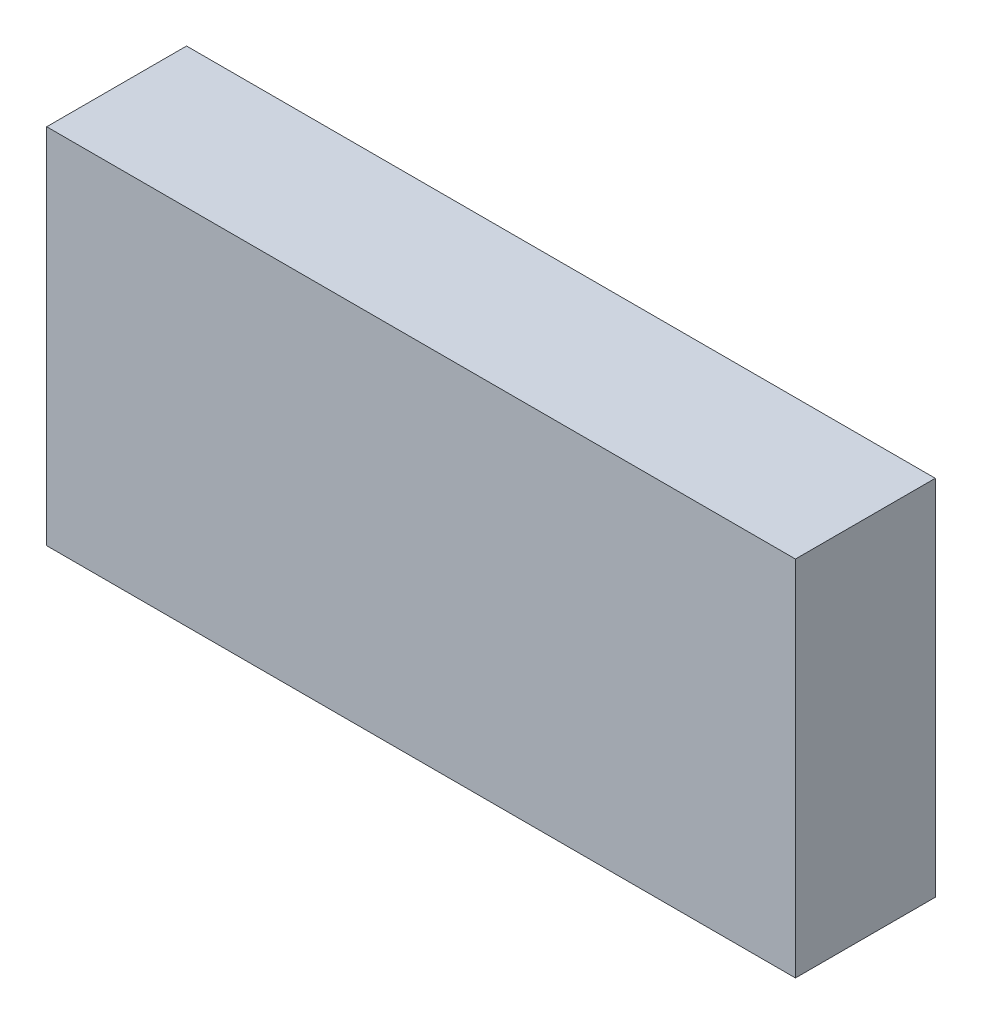
ISO-10303-21;
HEADER;
FILE_DESCRIPTION(('STEP AP214'),'2;1');
FILE_NAME('part.step','',(''),(''),'','','');
FILE_SCHEMA(('AUTOMOTIVE_DESIGN { 1 0 10303 214 1 1 1 1 }'));
ENDSEC;
DATA;
#1=APPLICATION_CONTEXT('core data for automotive mechanical design processes');
#2=APPLICATION_PROTOCOL_DEFINITION('international standard','automotive_design',2000,#1);
#3=PRODUCT_CONTEXT('',#1,'mechanical');
#4=PRODUCT('Part','Part','',(#3));
#5=PRODUCT_RELATED_PRODUCT_CATEGORY('part','',(#4));
#6=PRODUCT_DEFINITION_FORMATION('','',#4);
#7=PRODUCT_DEFINITION_CONTEXT('part definition',#1,'design');
#8=PRODUCT_DEFINITION('design','',#6,#7);
#9=PRODUCT_DEFINITION_SHAPE('','',#8);
#10=(LENGTH_UNIT() NAMED_UNIT(*) SI_UNIT(.MILLI.,.METRE.));
#11=(NAMED_UNIT(*) PLANE_ANGLE_UNIT() SI_UNIT($,.RADIAN.));
#12=(NAMED_UNIT(*) SI_UNIT($,.STERADIAN.) SOLID_ANGLE_UNIT());
#13=UNCERTAINTY_MEASURE_WITH_UNIT(LENGTH_MEASURE(1.E-05),#10,'distance_accuracy_value','');
#14=(GEOMETRIC_REPRESENTATION_CONTEXT(3) GLOBAL_UNCERTAINTY_ASSIGNED_CONTEXT((#13)) GLOBAL_UNIT_ASSIGNED_CONTEXT((#10,
#11,#12)) REPRESENTATION_CONTEXT('',''));
#15=CARTESIAN_POINT('',(0.,0.,0.));
#16=DIRECTION('',(0.,0.,1.));
#17=DIRECTION('',(1.,0.,0.));
#18=AXIS2_PLACEMENT_3D('',#15,#16,#17);
#19=CARTESIAN_POINT('',(11.8077123465525,-11.5564845194634,-7.7));
#20=DIRECTION('',(0.,0.,-1.));
#21=DIRECTION('',(-1.,0.,0.));
#22=AXIS2_PLACEMENT_3D('',#19,#20,#21);
#23=PLANE('',#22);
#24=DIRECTION('',(1.,0.,0.));
#25=VECTOR('',#24,1.);
#26=CARTESIAN_POINT('',(28.1375272939123,-19.4701641360524,-7.7));
#27=LINE('',#26,#25);
#28=CARTESIAN_POINT('',(-4.52210260080733,-19.4701641360524,-7.7));
#29=VERTEX_POINT('',#28);
#30=CARTESIAN_POINT('',(28.1375272939123,-19.4701641360524,-7.7));
#31=VERTEX_POINT('',#30);
#32=EDGE_CURVE('E68',#29,#31,#27,.T.);
#33=ORIENTED_EDGE('',*,*,#32,.F.);
#34=DIRECTION('',(0.,1.,0.));
#35=VECTOR('',#34,1.);
#36=CARTESIAN_POINT('',(-4.52210260080733,-19.4701641360524,-7.7));
#37=LINE('',#36,#35);
#38=CARTESIAN_POINT('',(-4.52210260080733,-3.64280490287433,-7.7));
#39=VERTEX_POINT('',#38);
#40=EDGE_CURVE('E55',#39,#29,#37,.F.);
#41=ORIENTED_EDGE('',*,*,#40,.F.);
#42=DIRECTION('',(1.,0.,0.));
#43=VECTOR('',#42,1.);
#44=CARTESIAN_POINT('',(-4.52210260080733,-3.64280490287433,-7.7));
#45=LINE('',#44,#43);
#46=CARTESIAN_POINT('',(28.1375272939123,-3.64280490287433,-7.7));
#47=VERTEX_POINT('',#46);
#48=EDGE_CURVE('E20',#47,#39,#45,.F.);
#49=ORIENTED_EDGE('',*,*,#48,.F.);
#50=DIRECTION('',(0.,1.,0.));
#51=VECTOR('',#50,1.);
#52=CARTESIAN_POINT('',(28.1375272939123,-3.64280490287433,-7.7));
#53=LINE('',#52,#51);
#54=EDGE_CURVE('E80',#31,#47,#53,.T.);
#55=ORIENTED_EDGE('',*,*,#54,.F.);
#56=EDGE_LOOP('',(#33,#41,#49,#55));
#57=FACE_BOUND('',#56,.T.);
#58=ADVANCED_FACE('F17',(#57),#23,.T.);
#59=CARTESIAN_POINT('',(-4.52210260080733,-3.64280490287433,-1.6));
#60=DIRECTION('',(0.,1.,0.));
#61=DIRECTION('',(0.,0.,1.));
#62=AXIS2_PLACEMENT_3D('',#59,#60,#61);
#63=PLANE('',#62);
#64=ORIENTED_EDGE('',*,*,#48,.T.);
#65=DIRECTION('',(0.,0.,1.));
#66=VECTOR('',#65,1.);
#67=CARTESIAN_POINT('',(-4.52210260080733,-3.64280490287433,-1.6));
#68=LINE('',#67,#66);
#69=CARTESIAN_POINT('',(-4.52210260080733,-3.64280490287433,-1.6));
#70=VERTEX_POINT('',#69);
#71=EDGE_CURVE('E61',#70,#39,#68,.F.);
#72=ORIENTED_EDGE('',*,*,#71,.F.);
#73=DIRECTION('',(1.,0.,0.));
#74=VECTOR('',#73,1.);
#75=CARTESIAN_POINT('',(11.8077123465525,-3.64280490287433,-1.6));
#76=LINE('',#75,#74);
#77=CARTESIAN_POINT('',(28.1375272939123,-3.64280490287433,-1.6));
#78=VERTEX_POINT('',#77);
#79=EDGE_CURVE('E83',#78,#70,#76,.F.);
#80=ORIENTED_EDGE('',*,*,#79,.F.);
#81=DIRECTION('',(0.,0.,-1.));
#82=VECTOR('',#81,1.);
#83=CARTESIAN_POINT('',(28.1375272939123,-3.64280490287433,-1.6));
#84=LINE('',#83,#82);
#85=EDGE_CURVE('E64',#47,#78,#84,.F.);
#86=ORIENTED_EDGE('',*,*,#85,.F.);
#87=EDGE_LOOP('',(#64,#72,#80,#86));
#88=FACE_BOUND('',#87,.T.);
#89=ADVANCED_FACE('F60',(#88),#63,.T.);
#90=CARTESIAN_POINT('',(-4.52210260080733,-19.4701641360524,-1.6));
#91=DIRECTION('',(-1.,0.,0.));
#92=DIRECTION('',(0.,0.,1.));
#93=AXIS2_PLACEMENT_3D('',#90,#91,#92);
#94=PLANE('',#93);
#95=ORIENTED_EDGE('',*,*,#40,.T.);
#96=DIRECTION('',(0.,0.,-1.));
#97=VECTOR('',#96,1.);
#98=CARTESIAN_POINT('',(-4.52210260080733,-19.4701641360524,-1.6));
#99=LINE('',#98,#97);
#100=CARTESIAN_POINT('',(-4.52210260080733,-19.4701641360524,-1.6));
#101=VERTEX_POINT('',#100);
#102=EDGE_CURVE('E70',#101,#29,#99,.T.);
#103=ORIENTED_EDGE('',*,*,#102,.F.);
#104=DIRECTION('',(0.,1.,0.));
#105=VECTOR('',#104,1.);
#106=CARTESIAN_POINT('',(-4.52210260080733,-11.5564845194634,-1.6));
#107=LINE('',#106,#105);
#108=EDGE_CURVE('E74',#70,#101,#107,.F.);
#109=ORIENTED_EDGE('',*,*,#108,.F.);
#110=ORIENTED_EDGE('',*,*,#71,.T.);
#111=EDGE_LOOP('',(#95,#103,#109,#110));
#112=FACE_BOUND('',#111,.T.);
#113=ADVANCED_FACE('F72',(#112),#94,.T.);
#114=CARTESIAN_POINT('',(28.1375272939123,-19.4701641360524,-1.6));
#115=DIRECTION('',(0.,-1.,0.));
#116=DIRECTION('',(0.,0.,-1.));
#117=AXIS2_PLACEMENT_3D('',#114,#115,#116);
#118=PLANE('',#117);
#119=ORIENTED_EDGE('',*,*,#32,.T.);
#120=DIRECTION('',(0.,0.,-1.));
#121=VECTOR('',#120,1.);
#122=CARTESIAN_POINT('',(28.1375272939123,-19.4701641360524,-1.6));
#123=LINE('',#122,#121);
#124=CARTESIAN_POINT('',(28.1375272939123,-19.4701641360524,-1.6));
#125=VERTEX_POINT('',#124);
#126=EDGE_CURVE('E35',#125,#31,#123,.T.);
#127=ORIENTED_EDGE('',*,*,#126,.F.);
#128=DIRECTION('',(1.,0.,0.));
#129=VECTOR('',#128,1.);
#130=CARTESIAN_POINT('',(11.8077123465525,-19.4701641360524,-1.6));
#131=LINE('',#130,#129);
#132=EDGE_CURVE('E26',#101,#125,#131,.T.);
#133=ORIENTED_EDGE('',*,*,#132,.F.);
#134=ORIENTED_EDGE('',*,*,#102,.T.);
#135=EDGE_LOOP('',(#119,#127,#133,#134));
#136=FACE_BOUND('',#135,.T.);
#137=ADVANCED_FACE('F89',(#136),#118,.T.);
#138=CARTESIAN_POINT('',(28.1375272939123,-3.64280490287433,-1.6));
#139=DIRECTION('',(1.,0.,0.));
#140=DIRECTION('',(0.,0.,-1.));
#141=AXIS2_PLACEMENT_3D('',#138,#139,#140);
#142=PLANE('',#141);
#143=ORIENTED_EDGE('',*,*,#54,.T.);
#144=ORIENTED_EDGE('',*,*,#85,.T.);
#145=DIRECTION('',(0.,1.,0.));
#146=VECTOR('',#145,1.);
#147=CARTESIAN_POINT('',(28.1375272939123,-11.5564845194634,-1.6));
#148=LINE('',#147,#146);
#149=EDGE_CURVE('E11',#125,#78,#148,.T.);
#150=ORIENTED_EDGE('',*,*,#149,.F.);
#151=ORIENTED_EDGE('',*,*,#126,.T.);
#152=EDGE_LOOP('',(#143,#144,#150,#151));
#153=FACE_BOUND('',#152,.T.);
#154=ADVANCED_FACE('F91',(#153),#142,.T.);
#155=CARTESIAN_POINT('',(11.8077123465525,-11.5564845194634,-1.6));
#156=DIRECTION('',(0.,0.,1.));
#157=DIRECTION('',(1.,0.,0.));
#158=AXIS2_PLACEMENT_3D('',#155,#156,#157);
#159=PLANE('',#158);
#160=ORIENTED_EDGE('',*,*,#132,.T.);
#161=ORIENTED_EDGE('',*,*,#149,.T.);
#162=ORIENTED_EDGE('',*,*,#79,.T.);
#163=ORIENTED_EDGE('',*,*,#108,.T.);
#164=EDGE_LOOP('',(#160,#161,#162,#163));
#165=FACE_BOUND('',#164,.T.);
#166=ADVANCED_FACE('F88',(#165),#159,.T.);
#167=CLOSED_SHELL('',(#58,#89,#113,#137,#154,#166));
#168=MANIFOLD_SOLID_BREP('B1',#167);
#169=ADVANCED_BREP_SHAPE_REPRESENTATION('',(#18,#168),#14);
#170=SHAPE_DEFINITION_REPRESENTATION(#9,#169);
ENDSEC;
END-ISO-10303-21;
